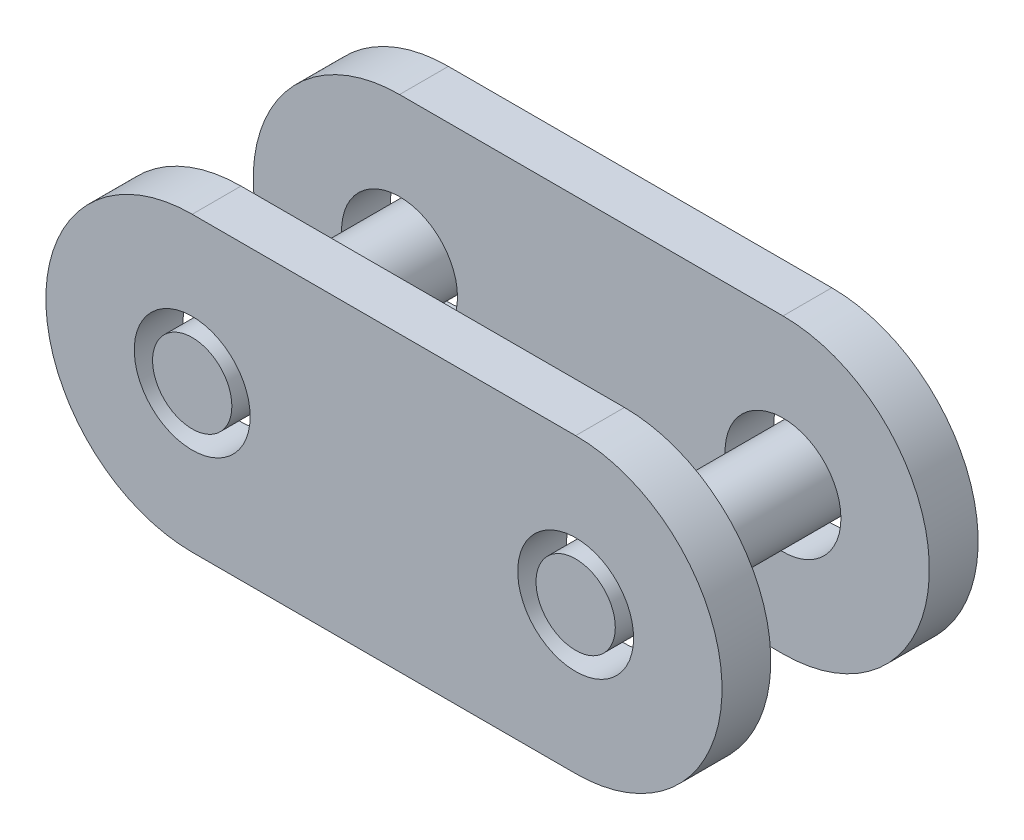
ISO-10303-21;
HEADER;
FILE_DESCRIPTION(('STEP AP214'),'2;1');
FILE_NAME('part.step','',(''),(''),'','','');
FILE_SCHEMA(('AUTOMOTIVE_DESIGN { 1 0 10303 214 1 1 1 1 }'));
ENDSEC;
DATA;
#1=APPLICATION_CONTEXT('core data for automotive mechanical design processes');
#2=APPLICATION_PROTOCOL_DEFINITION('international standard','automotive_design',2000,#1);
#3=PRODUCT_CONTEXT('',#1,'mechanical');
#4=PRODUCT('Part','Part','',(#3));
#5=PRODUCT_RELATED_PRODUCT_CATEGORY('part','',(#4));
#6=PRODUCT_DEFINITION_FORMATION('','',#4);
#7=PRODUCT_DEFINITION_CONTEXT('part definition',#1,'design');
#8=PRODUCT_DEFINITION('design','',#6,#7);
#9=PRODUCT_DEFINITION_SHAPE('','',#8);
#10=(LENGTH_UNIT() NAMED_UNIT(*) SI_UNIT(.MILLI.,.METRE.));
#11=(NAMED_UNIT(*) PLANE_ANGLE_UNIT() SI_UNIT($,.RADIAN.));
#12=(NAMED_UNIT(*) SI_UNIT($,.STERADIAN.) SOLID_ANGLE_UNIT());
#13=UNCERTAINTY_MEASURE_WITH_UNIT(LENGTH_MEASURE(1.E-05),#10,'distance_accuracy_value','');
#14=(GEOMETRIC_REPRESENTATION_CONTEXT(3) GLOBAL_UNCERTAINTY_ASSIGNED_CONTEXT((#13)) GLOBAL_UNIT_ASSIGNED_CONTEXT((#10,
#11,#12)) REPRESENTATION_CONTEXT('',''));
#15=CARTESIAN_POINT('',(0.,0.,0.));
#16=DIRECTION('',(0.,0.,1.));
#17=DIRECTION('',(1.,0.,0.));
#18=AXIS2_PLACEMENT_3D('',#15,#16,#17);
#19=CARTESIAN_POINT('',(6.28764255227391,0.,2.1));
#20=DIRECTION('',(0.,0.,-1.));
#21=DIRECTION('',(-1.,0.,0.));
#22=AXIS2_PLACEMENT_3D('',#19,#20,#21);
#23=CYLINDRICAL_SURFACE('',#22,0.65);
#24=CARTESIAN_POINT('',(6.28764255227391,0.,2.1));
#25=DIRECTION('',(0.,0.,1.));
#26=DIRECTION('',(1.,0.,0.));
#27=AXIS2_PLACEMENT_3D('',#24,#25,#26);
#28=CIRCLE('',#27,0.65);
#29=CARTESIAN_POINT('',(6.93764255227391,0.,2.1));
#30=VERTEX_POINT('',#29);
#31=EDGE_CURVE('E55',#30,#30,#28,.T.);
#32=ORIENTED_EDGE('',*,*,#31,.F.);
#33=EDGE_LOOP('',(#32));
#34=FACE_BOUND('',#33,.T.);
#35=CARTESIAN_POINT('',(6.28764255227391,0.,-2.1));
#36=DIRECTION('',(0.,0.,1.));
#37=DIRECTION('',(1.,0.,0.));
#38=AXIS2_PLACEMENT_3D('',#35,#36,#37);
#39=CIRCLE('',#38,0.65);
#40=CARTESIAN_POINT('',(6.93764255227391,0.,-2.1));
#41=VERTEX_POINT('',#40);
#42=EDGE_CURVE('E11',#41,#41,#39,.T.);
#43=ORIENTED_EDGE('',*,*,#42,.T.);
#44=EDGE_LOOP('',(#43));
#45=FACE_BOUND('',#44,.T.);
#46=ADVANCED_FACE('F48',(#34,#45),#23,.T.);
#47=CARTESIAN_POINT('',(6.28764255227391,0.,2.1));
#48=DIRECTION('',(0.,0.,1.));
#49=DIRECTION('',(1.,0.,0.));
#50=AXIS2_PLACEMENT_3D('',#47,#48,#49);
#51=PLANE('',#50);
#52=ORIENTED_EDGE('',*,*,#31,.T.);
#53=EDGE_LOOP('',(#52));
#54=FACE_BOUND('',#53,.T.);
#55=ADVANCED_FACE('F49',(#54),#51,.T.);
#56=CARTESIAN_POINT('',(6.28764255227391,0.,-2.1));
#57=DIRECTION('',(0.,0.,1.));
#58=DIRECTION('',(1.,0.,0.));
#59=AXIS2_PLACEMENT_3D('',#56,#57,#58);
#60=PLANE('',#59);
#61=ORIENTED_EDGE('',*,*,#42,.F.);
#62=EDGE_LOOP('',(#61));
#63=FACE_BOUND('',#62,.T.);
#64=ADVANCED_FACE('F67',(#63),#60,.F.);
#65=CLOSED_SHELL('',(#46,#55,#64));
#66=MANIFOLD_SOLID_BREP('B2',#65);
#67=CARTESIAN_POINT('',(0.,0.,2.1));
#68=DIRECTION('',(0.,0.,-1.));
#69=DIRECTION('',(-1.,0.,0.));
#70=AXIS2_PLACEMENT_3D('',#67,#68,#69);
#71=CYLINDRICAL_SURFACE('',#70,0.65);
#72=CARTESIAN_POINT('',(0.,0.,2.1));
#73=DIRECTION('',(0.,0.,1.));
#74=DIRECTION('',(1.,0.,0.));
#75=AXIS2_PLACEMENT_3D('',#72,#73,#74);
#76=CIRCLE('',#75,0.65);
#77=CARTESIAN_POINT('',(0.65,0.,2.1));
#78=VERTEX_POINT('',#77);
#79=EDGE_CURVE('E50',#78,#78,#76,.T.);
#80=ORIENTED_EDGE('',*,*,#79,.F.);
#81=EDGE_LOOP('',(#80));
#82=FACE_BOUND('',#81,.T.);
#83=CARTESIAN_POINT('',(0.,0.,-2.1));
#84=DIRECTION('',(0.,0.,1.));
#85=DIRECTION('',(1.,0.,0.));
#86=AXIS2_PLACEMENT_3D('',#83,#84,#85);
#87=CIRCLE('',#86,0.65);
#88=CARTESIAN_POINT('',(0.65,0.,-2.1));
#89=VERTEX_POINT('',#88);
#90=EDGE_CURVE('E105',#89,#89,#87,.T.);
#91=ORIENTED_EDGE('',*,*,#90,.T.);
#92=EDGE_LOOP('',(#91));
#93=FACE_BOUND('',#92,.T.);
#94=ADVANCED_FACE('F97',(#82,#93),#71,.T.);
#95=CARTESIAN_POINT('',(0.,0.,2.1));
#96=DIRECTION('',(0.,0.,1.));
#97=DIRECTION('',(1.,0.,0.));
#98=AXIS2_PLACEMENT_3D('',#95,#96,#97);
#99=PLANE('',#98);
#100=ORIENTED_EDGE('',*,*,#79,.T.);
#101=EDGE_LOOP('',(#100));
#102=FACE_BOUND('',#101,.T.);
#103=ADVANCED_FACE('F111',(#102),#99,.T.);
#104=CARTESIAN_POINT('',(0.,0.,-2.1));
#105=DIRECTION('',(0.,0.,1.));
#106=DIRECTION('',(1.,0.,0.));
#107=AXIS2_PLACEMENT_3D('',#104,#105,#106);
#108=PLANE('',#107);
#109=ORIENTED_EDGE('',*,*,#90,.F.);
#110=EDGE_LOOP('',(#109));
#111=FACE_BOUND('',#110,.T.);
#112=ADVANCED_FACE('F115',(#111),#108,.F.);
#113=CLOSED_SHELL('',(#94,#103,#112));
#114=MANIFOLD_SOLID_BREP('B6',#113);
#115=CARTESIAN_POINT('',(0.,0.,-1.3));
#116=DIRECTION('',(0.,0.,1.));
#117=DIRECTION('',(1.,0.,0.));
#118=AXIS2_PLACEMENT_3D('',#115,#116,#117);
#119=PLANE('',#118);
#120=CARTESIAN_POINT('',(0.,0.,-1.3));
#121=DIRECTION('',(0.,0.,1.));
#122=DIRECTION('',(1.,0.,0.));
#123=AXIS2_PLACEMENT_3D('',#120,#121,#122);
#124=CIRCLE('',#123,0.95);
#125=CARTESIAN_POINT('',(0.95,0.,-1.3));
#126=VERTEX_POINT('',#125);
#127=EDGE_CURVE('E216',#126,#126,#124,.T.);
#128=ORIENTED_EDGE('',*,*,#127,.F.);
#129=EDGE_LOOP('',(#128));
#130=FACE_BOUND('',#129,.T.);
#131=CARTESIAN_POINT('',(0.,0.,-1.3));
#132=DIRECTION('',(0.,0.,1.));
#133=DIRECTION('',(1.,0.,0.));
#134=AXIS2_PLACEMENT_3D('',#131,#132,#133);
#135=CIRCLE('',#134,2.4);
#136=CARTESIAN_POINT('',(0.,2.4,-1.3));
#137=VERTEX_POINT('',#136);
#138=CARTESIAN_POINT('',(0.,-2.4,-1.3));
#139=VERTEX_POINT('',#138);
#140=EDGE_CURVE('E203',#137,#139,#135,.T.);
#141=ORIENTED_EDGE('',*,*,#140,.T.);
#142=DIRECTION('',(1.,0.,0.));
#143=VECTOR('',#142,1.);
#144=CARTESIAN_POINT('',(0.,-2.4,-1.3));
#145=LINE('',#144,#143);
#146=CARTESIAN_POINT('',(6.28764255227391,-2.4,-1.3));
#147=VERTEX_POINT('',#146);
#148=EDGE_CURVE('E198',#139,#147,#145,.T.);
#149=ORIENTED_EDGE('',*,*,#148,.T.);
#150=CARTESIAN_POINT('',(6.28764255227391,0.,-1.3));
#151=DIRECTION('',(0.,0.,1.));
#152=DIRECTION('',(1.,0.,0.));
#153=AXIS2_PLACEMENT_3D('',#150,#151,#152);
#154=CIRCLE('',#153,2.4);
#155=CARTESIAN_POINT('',(6.28764255227391,2.4,-1.3));
#156=VERTEX_POINT('',#155);
#157=EDGE_CURVE('E200',#147,#156,#154,.T.);
#158=ORIENTED_EDGE('',*,*,#157,.T.);
#159=DIRECTION('',(-1.,0.,0.));
#160=VECTOR('',#159,1.);
#161=CARTESIAN_POINT('',(6.28764255227391,2.4,-1.3));
#162=LINE('',#161,#160);
#163=EDGE_CURVE('E167',#156,#137,#162,.T.);
#164=ORIENTED_EDGE('',*,*,#163,.T.);
#165=EDGE_LOOP('',(#141,#149,#158,#164));
#166=FACE_BOUND('',#165,.T.);
#167=CARTESIAN_POINT('',(6.28764255227391,0.,-1.3));
#168=DIRECTION('',(0.,0.,1.));
#169=DIRECTION('',(1.,0.,0.));
#170=AXIS2_PLACEMENT_3D('',#167,#168,#169);
#171=CIRCLE('',#170,0.95);
#172=CARTESIAN_POINT('',(7.23764255227391,0.,-1.3));
#173=VERTEX_POINT('',#172);
#174=EDGE_CURVE('E231',#173,#173,#171,.T.);
#175=ORIENTED_EDGE('',*,*,#174,.F.);
#176=EDGE_LOOP('',(#175));
#177=FACE_BOUND('',#176,.T.);
#178=ADVANCED_FACE('F149',(#130,#166,#177),#119,.T.);
#179=CARTESIAN_POINT('',(0.,0.,-2.1));
#180=DIRECTION('',(0.,0.,1.));
#181=DIRECTION('',(1.,0.,0.));
#182=AXIS2_PLACEMENT_3D('',#179,#180,#181);
#183=PLANE('',#182);
#184=CARTESIAN_POINT('',(0.,0.,-2.1));
#185=DIRECTION('',(0.,0.,1.));
#186=DIRECTION('',(1.,0.,0.));
#187=AXIS2_PLACEMENT_3D('',#184,#185,#186);
#188=CIRCLE('',#187,2.4);
#189=CARTESIAN_POINT('',(0.,2.4,-2.1));
#190=VERTEX_POINT('',#189);
#191=CARTESIAN_POINT('',(0.,-2.4,-2.1));
#192=VERTEX_POINT('',#191);
#193=EDGE_CURVE('E213',#190,#192,#188,.T.);
#194=ORIENTED_EDGE('',*,*,#193,.F.);
#195=DIRECTION('',(-1.,0.,0.));
#196=VECTOR('',#195,1.);
#197=CARTESIAN_POINT('',(6.28764255227391,2.4,-2.1));
#198=LINE('',#197,#196);
#199=CARTESIAN_POINT('',(6.28764255227391,2.4,-2.1));
#200=VERTEX_POINT('',#199);
#201=EDGE_CURVE('E188',#200,#190,#198,.T.);
#202=ORIENTED_EDGE('',*,*,#201,.F.);
#203=CARTESIAN_POINT('',(6.28764255227391,0.,-2.1));
#204=DIRECTION('',(0.,0.,1.));
#205=DIRECTION('',(1.,0.,0.));
#206=AXIS2_PLACEMENT_3D('',#203,#204,#205);
#207=CIRCLE('',#206,2.4);
#208=CARTESIAN_POINT('',(6.28764255227391,-2.4,-2.1));
#209=VERTEX_POINT('',#208);
#210=EDGE_CURVE('E181',#209,#200,#207,.T.);
#211=ORIENTED_EDGE('',*,*,#210,.F.);
#212=DIRECTION('',(1.,0.,0.));
#213=VECTOR('',#212,1.);
#214=CARTESIAN_POINT('',(0.,-2.4,-2.1));
#215=LINE('',#214,#213);
#216=EDGE_CURVE('E202',#192,#209,#215,.T.);
#217=ORIENTED_EDGE('',*,*,#216,.F.);
#218=EDGE_LOOP('',(#194,#202,#211,#217));
#219=FACE_BOUND('',#218,.T.);
#220=CARTESIAN_POINT('',(0.,0.,-2.1));
#221=DIRECTION('',(0.,0.,1.));
#222=DIRECTION('',(1.,0.,0.));
#223=AXIS2_PLACEMENT_3D('',#220,#221,#222);
#224=CIRCLE('',#223,0.95);
#225=CARTESIAN_POINT('',(0.95,0.,-2.1));
#226=VERTEX_POINT('',#225);
#227=EDGE_CURVE('E229',#226,#226,#224,.T.);
#228=ORIENTED_EDGE('',*,*,#227,.T.);
#229=EDGE_LOOP('',(#228));
#230=FACE_BOUND('',#229,.T.);
#231=CARTESIAN_POINT('',(6.28764255227391,0.,-2.1));
#232=DIRECTION('',(0.,0.,1.));
#233=DIRECTION('',(1.,0.,0.));
#234=AXIS2_PLACEMENT_3D('',#231,#232,#233);
#235=CIRCLE('',#234,0.95);
#236=CARTESIAN_POINT('',(7.23764255227391,0.,-2.1));
#237=VERTEX_POINT('',#236);
#238=EDGE_CURVE('E233',#237,#237,#235,.T.);
#239=ORIENTED_EDGE('',*,*,#238,.T.);
#240=EDGE_LOOP('',(#239));
#241=FACE_BOUND('',#240,.T.);
#242=ADVANCED_FACE('F221',(#219,#230,#241),#183,.F.);
#243=CARTESIAN_POINT('',(0.,0.,-1.3));
#244=DIRECTION('',(0.,0.,-1.));
#245=DIRECTION('',(-1.,0.,0.));
#246=AXIS2_PLACEMENT_3D('',#243,#244,#245);
#247=CYLINDRICAL_SURFACE('',#246,2.4);
#248=ORIENTED_EDGE('',*,*,#193,.T.);
#249=DIRECTION('',(0.,0.,-1.));
#250=VECTOR('',#249,1.);
#251=CARTESIAN_POINT('',(0.,-2.4,-1.3));
#252=LINE('',#251,#250);
#253=EDGE_CURVE('E100',#139,#192,#252,.T.);
#254=ORIENTED_EDGE('',*,*,#253,.F.);
#255=ORIENTED_EDGE('',*,*,#140,.F.);
#256=DIRECTION('',(0.,0.,-1.));
#257=VECTOR('',#256,1.);
#258=CARTESIAN_POINT('',(0.,2.4,-1.3));
#259=LINE('',#258,#257);
#260=EDGE_CURVE('E207',#137,#190,#259,.T.);
#261=ORIENTED_EDGE('',*,*,#260,.T.);
#262=EDGE_LOOP('',(#248,#254,#255,#261));
#263=FACE_BOUND('',#262,.T.);
#264=ADVANCED_FACE('F151',(#263),#247,.T.);
#265=CARTESIAN_POINT('',(0.,-2.4,-1.3));
#266=DIRECTION('',(0.,1.,0.));
#267=DIRECTION('',(0.,0.,1.));
#268=AXIS2_PLACEMENT_3D('',#265,#266,#267);
#269=PLANE('',#268);
#270=ORIENTED_EDGE('',*,*,#216,.T.);
#271=DIRECTION('',(0.,0.,-1.));
#272=VECTOR('',#271,1.);
#273=CARTESIAN_POINT('',(6.28764255227391,-2.4,-1.3));
#274=LINE('',#273,#272);
#275=EDGE_CURVE('E158',#147,#209,#274,.T.);
#276=ORIENTED_EDGE('',*,*,#275,.F.);
#277=ORIENTED_EDGE('',*,*,#148,.F.);
#278=ORIENTED_EDGE('',*,*,#253,.T.);
#279=EDGE_LOOP('',(#270,#276,#277,#278));
#280=FACE_BOUND('',#279,.T.);
#281=ADVANCED_FACE('F204',(#280),#269,.F.);
#282=CARTESIAN_POINT('',(6.28764255227391,0.,-1.3));
#283=DIRECTION('',(0.,0.,-1.));
#284=DIRECTION('',(-1.,0.,0.));
#285=AXIS2_PLACEMENT_3D('',#282,#283,#284);
#286=CYLINDRICAL_SURFACE('',#285,2.4);
#287=ORIENTED_EDGE('',*,*,#210,.T.);
#288=DIRECTION('',(0.,0.,-1.));
#289=VECTOR('',#288,1.);
#290=CARTESIAN_POINT('',(6.28764255227391,2.4,-1.3));
#291=LINE('',#290,#289);
#292=EDGE_CURVE('E206',#156,#200,#291,.T.);
#293=ORIENTED_EDGE('',*,*,#292,.F.);
#294=ORIENTED_EDGE('',*,*,#157,.F.);
#295=ORIENTED_EDGE('',*,*,#275,.T.);
#296=EDGE_LOOP('',(#287,#293,#294,#295));
#297=FACE_BOUND('',#296,.T.);
#298=ADVANCED_FACE('F210',(#297),#286,.T.);
#299=CARTESIAN_POINT('',(6.28764255227391,2.4,-1.3));
#300=DIRECTION('',(0.,-1.,0.));
#301=DIRECTION('',(0.,0.,-1.));
#302=AXIS2_PLACEMENT_3D('',#299,#300,#301);
#303=PLANE('',#302);
#304=ORIENTED_EDGE('',*,*,#201,.T.);
#305=ORIENTED_EDGE('',*,*,#260,.F.);
#306=ORIENTED_EDGE('',*,*,#163,.F.);
#307=ORIENTED_EDGE('',*,*,#292,.T.);
#308=EDGE_LOOP('',(#304,#305,#306,#307));
#309=FACE_BOUND('',#308,.T.);
#310=ADVANCED_FACE('F222',(#309),#303,.F.);
#311=CARTESIAN_POINT('',(0.,0.,-1.3));
#312=DIRECTION('',(0.,0.,-1.));
#313=DIRECTION('',(-1.,0.,0.));
#314=AXIS2_PLACEMENT_3D('',#311,#312,#313);
#315=CYLINDRICAL_SURFACE('',#314,0.95);
#316=ORIENTED_EDGE('',*,*,#127,.T.);
#317=EDGE_LOOP('',(#316));
#318=FACE_BOUND('',#317,.T.);
#319=ORIENTED_EDGE('',*,*,#227,.F.);
#320=EDGE_LOOP('',(#319));
#321=FACE_BOUND('',#320,.T.);
#322=ADVANCED_FACE('F253',(#318,#321),#315,.F.);
#323=CARTESIAN_POINT('',(6.28764255227391,0.,-1.3));
#324=DIRECTION('',(0.,0.,-1.));
#325=DIRECTION('',(-1.,0.,0.));
#326=AXIS2_PLACEMENT_3D('',#323,#324,#325);
#327=CYLINDRICAL_SURFACE('',#326,0.95);
#328=ORIENTED_EDGE('',*,*,#174,.T.);
#329=EDGE_LOOP('',(#328));
#330=FACE_BOUND('',#329,.T.);
#331=ORIENTED_EDGE('',*,*,#238,.F.);
#332=EDGE_LOOP('',(#331));
#333=FACE_BOUND('',#332,.T.);
#334=ADVANCED_FACE('F238',(#330,#333),#327,.F.);
#335=CLOSED_SHELL('',(#178,#242,#264,#281,#298,#310,#322,#334));
#336=MANIFOLD_SOLID_BREP('B45',#335);
#337=CARTESIAN_POINT('',(0.,0.,2.1));
#338=DIRECTION('',(0.,0.,1.));
#339=DIRECTION('',(1.,0.,0.));
#340=AXIS2_PLACEMENT_3D('',#337,#338,#339);
#341=PLANE('',#340);
#342=CARTESIAN_POINT('',(0.,0.,2.1));
#343=DIRECTION('',(0.,0.,1.));
#344=DIRECTION('',(1.,0.,0.));
#345=AXIS2_PLACEMENT_3D('',#342,#343,#344);
#346=CIRCLE('',#345,0.95);
#347=CARTESIAN_POINT('',(0.95,0.,2.1));
#348=VERTEX_POINT('',#347);
#349=EDGE_CURVE('E385',#348,#348,#346,.T.);
#350=ORIENTED_EDGE('',*,*,#349,.F.);
#351=EDGE_LOOP('',(#350));
#352=FACE_BOUND('',#351,.T.);
#353=CARTESIAN_POINT('',(0.,0.,2.1));
#354=DIRECTION('',(0.,0.,1.));
#355=DIRECTION('',(1.,0.,0.));
#356=AXIS2_PLACEMENT_3D('',#353,#354,#355);
#357=CIRCLE('',#356,2.4);
#358=CARTESIAN_POINT('',(0.,2.4,2.1));
#359=VERTEX_POINT('',#358);
#360=CARTESIAN_POINT('',(0.,-2.4,2.1));
#361=VERTEX_POINT('',#360);
#362=EDGE_CURVE('E370',#359,#361,#357,.T.);
#363=ORIENTED_EDGE('',*,*,#362,.T.);
#364=DIRECTION('',(1.,0.,0.));
#365=VECTOR('',#364,1.);
#366=CARTESIAN_POINT('',(0.,-2.4,2.1));
#367=LINE('',#366,#365);
#368=CARTESIAN_POINT('',(6.28764255227391,-2.4,2.1));
#369=VERTEX_POINT('',#368);
#370=EDGE_CURVE('E362',#361,#369,#367,.T.);
#371=ORIENTED_EDGE('',*,*,#370,.T.);
#372=CARTESIAN_POINT('',(6.28764255227391,0.,2.1));
#373=DIRECTION('',(0.,0.,1.));
#374=DIRECTION('',(1.,0.,0.));
#375=AXIS2_PLACEMENT_3D('',#372,#373,#374);
#376=CIRCLE('',#375,2.4);
#377=CARTESIAN_POINT('',(6.28764255227391,2.4,2.1));
#378=VERTEX_POINT('',#377);
#379=EDGE_CURVE('E364',#369,#378,#376,.T.);
#380=ORIENTED_EDGE('',*,*,#379,.T.);
#381=DIRECTION('',(-1.,0.,0.));
#382=VECTOR('',#381,1.);
#383=CARTESIAN_POINT('',(6.28764255227391,2.4,2.1));
#384=LINE('',#383,#382);
#385=EDGE_CURVE('E335',#378,#359,#384,.T.);
#386=ORIENTED_EDGE('',*,*,#385,.T.);
#387=EDGE_LOOP('',(#363,#371,#380,#386));
#388=FACE_BOUND('',#387,.T.);
#389=CARTESIAN_POINT('',(6.28764255227391,0.,2.1));
#390=DIRECTION('',(0.,0.,1.));
#391=DIRECTION('',(1.,0.,0.));
#392=AXIS2_PLACEMENT_3D('',#389,#390,#391);
#393=CIRCLE('',#392,0.95);
#394=CARTESIAN_POINT('',(7.23764255227391,0.,2.1));
#395=VERTEX_POINT('',#394);
#396=EDGE_CURVE('E397',#395,#395,#393,.T.);
#397=ORIENTED_EDGE('',*,*,#396,.F.);
#398=EDGE_LOOP('',(#397));
#399=FACE_BOUND('',#398,.T.);
#400=ADVANCED_FACE('F312',(#352,#388,#399),#341,.T.);
#401=CARTESIAN_POINT('',(0.,0.,1.3));
#402=DIRECTION('',(0.,0.,1.));
#403=DIRECTION('',(1.,0.,0.));
#404=AXIS2_PLACEMENT_3D('',#401,#402,#403);
#405=PLANE('',#404);
#406=CARTESIAN_POINT('',(0.,0.,1.3));
#407=DIRECTION('',(0.,0.,1.));
#408=DIRECTION('',(1.,0.,0.));
#409=AXIS2_PLACEMENT_3D('',#406,#407,#408);
#410=CIRCLE('',#409,2.4);
#411=CARTESIAN_POINT('',(0.,2.4,1.3));
#412=VERTEX_POINT('',#411);
#413=CARTESIAN_POINT('',(0.,-2.4,1.3));
#414=VERTEX_POINT('',#413);
#415=EDGE_CURVE('E377',#412,#414,#410,.T.);
#416=ORIENTED_EDGE('',*,*,#415,.F.);
#417=DIRECTION('',(-1.,0.,0.));
#418=VECTOR('',#417,1.);
#419=CARTESIAN_POINT('',(6.28764255227391,2.4,1.3));
#420=LINE('',#419,#418);
#421=CARTESIAN_POINT('',(6.28764255227391,2.4,1.3));
#422=VERTEX_POINT('',#421);
#423=EDGE_CURVE('E355',#422,#412,#420,.T.);
#424=ORIENTED_EDGE('',*,*,#423,.F.);
#425=CARTESIAN_POINT('',(6.28764255227391,0.,1.3));
#426=DIRECTION('',(0.,0.,1.));
#427=DIRECTION('',(1.,0.,0.));
#428=AXIS2_PLACEMENT_3D('',#425,#426,#427);
#429=CIRCLE('',#428,2.4);
#430=CARTESIAN_POINT('',(6.28764255227391,-2.4,1.3));
#431=VERTEX_POINT('',#430);
#432=EDGE_CURVE('E349',#431,#422,#429,.T.);
#433=ORIENTED_EDGE('',*,*,#432,.F.);
#434=DIRECTION('',(1.,0.,0.));
#435=VECTOR('',#434,1.);
#436=CARTESIAN_POINT('',(0.,-2.4,1.3));
#437=LINE('',#436,#435);
#438=EDGE_CURVE('E371',#414,#431,#437,.T.);
#439=ORIENTED_EDGE('',*,*,#438,.F.);
#440=EDGE_LOOP('',(#416,#424,#433,#439));
#441=FACE_BOUND('',#440,.T.);
#442=CARTESIAN_POINT('',(0.,0.,1.3));
#443=DIRECTION('',(0.,0.,1.));
#444=DIRECTION('',(1.,0.,0.));
#445=AXIS2_PLACEMENT_3D('',#442,#443,#444);
#446=CIRCLE('',#445,0.95);
#447=CARTESIAN_POINT('',(0.95,0.,1.3));
#448=VERTEX_POINT('',#447);
#449=EDGE_CURVE('E393',#448,#448,#446,.T.);
#450=ORIENTED_EDGE('',*,*,#449,.T.);
#451=EDGE_LOOP('',(#450));
#452=FACE_BOUND('',#451,.T.);
#453=CARTESIAN_POINT('',(6.28764255227391,0.,1.3));
#454=DIRECTION('',(0.,0.,1.));
#455=DIRECTION('',(1.,0.,0.));
#456=AXIS2_PLACEMENT_3D('',#453,#454,#455);
#457=CIRCLE('',#456,0.95);
#458=CARTESIAN_POINT('',(7.23764255227391,0.,1.3));
#459=VERTEX_POINT('',#458);
#460=EDGE_CURVE('E400',#459,#459,#457,.T.);
#461=ORIENTED_EDGE('',*,*,#460,.T.);
#462=EDGE_LOOP('',(#461));
#463=FACE_BOUND('',#462,.T.);
#464=ADVANCED_FACE('F388',(#441,#452,#463),#405,.F.);
#465=CARTESIAN_POINT('',(0.,0.,2.1));
#466=DIRECTION('',(0.,0.,-1.));
#467=DIRECTION('',(-1.,0.,0.));
#468=AXIS2_PLACEMENT_3D('',#465,#466,#467);
#469=CYLINDRICAL_SURFACE('',#468,2.4);
#470=ORIENTED_EDGE('',*,*,#415,.T.);
#471=DIRECTION('',(0.,0.,-1.));
#472=VECTOR('',#471,1.);
#473=CARTESIAN_POINT('',(0.,-2.4,2.1));
#474=LINE('',#473,#472);
#475=EDGE_CURVE('E150',#361,#414,#474,.T.);
#476=ORIENTED_EDGE('',*,*,#475,.F.);
#477=ORIENTED_EDGE('',*,*,#362,.F.);
#478=DIRECTION('',(0.,0.,-1.));
#479=VECTOR('',#478,1.);
#480=CARTESIAN_POINT('',(0.,2.4,2.1));
#481=LINE('',#480,#479);
#482=EDGE_CURVE('E374',#359,#412,#481,.T.);
#483=ORIENTED_EDGE('',*,*,#482,.T.);
#484=EDGE_LOOP('',(#470,#476,#477,#483));
#485=FACE_BOUND('',#484,.T.);
#486=ADVANCED_FACE('F320',(#485),#469,.T.);
#487=CARTESIAN_POINT('',(0.,-2.4,2.1));
#488=DIRECTION('',(0.,1.,0.));
#489=DIRECTION('',(0.,0.,1.));
#490=AXIS2_PLACEMENT_3D('',#487,#488,#489);
#491=PLANE('',#490);
#492=ORIENTED_EDGE('',*,*,#438,.T.);
#493=DIRECTION('',(0.,0.,-1.));
#494=VECTOR('',#493,1.);
#495=CARTESIAN_POINT('',(6.28764255227391,-2.4,2.1));
#496=LINE('',#495,#494);
#497=EDGE_CURVE('E322',#369,#431,#496,.T.);
#498=ORIENTED_EDGE('',*,*,#497,.F.);
#499=ORIENTED_EDGE('',*,*,#370,.F.);
#500=ORIENTED_EDGE('',*,*,#475,.T.);
#501=EDGE_LOOP('',(#492,#498,#499,#500));
#502=FACE_BOUND('',#501,.T.);
#503=ADVANCED_FACE('F367',(#502),#491,.F.);
#504=CARTESIAN_POINT('',(6.28764255227391,0.,2.1));
#505=DIRECTION('',(0.,0.,-1.));
#506=DIRECTION('',(-1.,0.,0.));
#507=AXIS2_PLACEMENT_3D('',#504,#505,#506);
#508=CYLINDRICAL_SURFACE('',#507,2.4);
#509=ORIENTED_EDGE('',*,*,#432,.T.);
#510=DIRECTION('',(0.,0.,-1.));
#511=VECTOR('',#510,1.);
#512=CARTESIAN_POINT('',(6.28764255227391,2.4,2.1));
#513=LINE('',#512,#511);
#514=EDGE_CURVE('E375',#378,#422,#513,.T.);
#515=ORIENTED_EDGE('',*,*,#514,.F.);
#516=ORIENTED_EDGE('',*,*,#379,.F.);
#517=ORIENTED_EDGE('',*,*,#497,.T.);
#518=EDGE_LOOP('',(#509,#515,#516,#517));
#519=FACE_BOUND('',#518,.T.);
#520=ADVANCED_FACE('F373',(#519),#508,.T.);
#521=CARTESIAN_POINT('',(6.28764255227391,2.4,2.1));
#522=DIRECTION('',(0.,-1.,0.));
#523=DIRECTION('',(0.,0.,-1.));
#524=AXIS2_PLACEMENT_3D('',#521,#522,#523);
#525=PLANE('',#524);
#526=ORIENTED_EDGE('',*,*,#423,.T.);
#527=ORIENTED_EDGE('',*,*,#482,.F.);
#528=ORIENTED_EDGE('',*,*,#385,.F.);
#529=ORIENTED_EDGE('',*,*,#514,.T.);
#530=EDGE_LOOP('',(#526,#527,#528,#529));
#531=FACE_BOUND('',#530,.T.);
#532=ADVANCED_FACE('F390',(#531),#525,.F.);
#533=CARTESIAN_POINT('',(0.,0.,2.1));
#534=DIRECTION('',(0.,0.,-1.));
#535=DIRECTION('',(-1.,0.,0.));
#536=AXIS2_PLACEMENT_3D('',#533,#534,#535);
#537=CYLINDRICAL_SURFACE('',#536,0.95);
#538=ORIENTED_EDGE('',*,*,#349,.T.);
#539=EDGE_LOOP('',(#538));
#540=FACE_BOUND('',#539,.T.);
#541=ORIENTED_EDGE('',*,*,#449,.F.);
#542=EDGE_LOOP('',(#541));
#543=FACE_BOUND('',#542,.T.);
#544=ADVANCED_FACE('F417',(#540,#543),#537,.F.);
#545=CARTESIAN_POINT('',(6.28764255227391,0.,2.1));
#546=DIRECTION('',(0.,0.,-1.));
#547=DIRECTION('',(-1.,0.,0.));
#548=AXIS2_PLACEMENT_3D('',#545,#546,#547);
#549=CYLINDRICAL_SURFACE('',#548,0.95);
#550=ORIENTED_EDGE('',*,*,#396,.T.);
#551=EDGE_LOOP('',(#550));
#552=FACE_BOUND('',#551,.T.);
#553=ORIENTED_EDGE('',*,*,#460,.F.);
#554=EDGE_LOOP('',(#553));
#555=FACE_BOUND('',#554,.T.);
#556=ADVANCED_FACE('F406',(#552,#555),#549,.F.);
#557=CLOSED_SHELL('',(#400,#464,#486,#503,#520,#532,#544,#556));
#558=MANIFOLD_SOLID_BREP('B93',#557);
#559=ADVANCED_BREP_SHAPE_REPRESENTATION('',(#18,#66,#114,#336,#558),#14);
#560=SHAPE_DEFINITION_REPRESENTATION(#9,#559);
ENDSEC;
END-ISO-10303-21;
